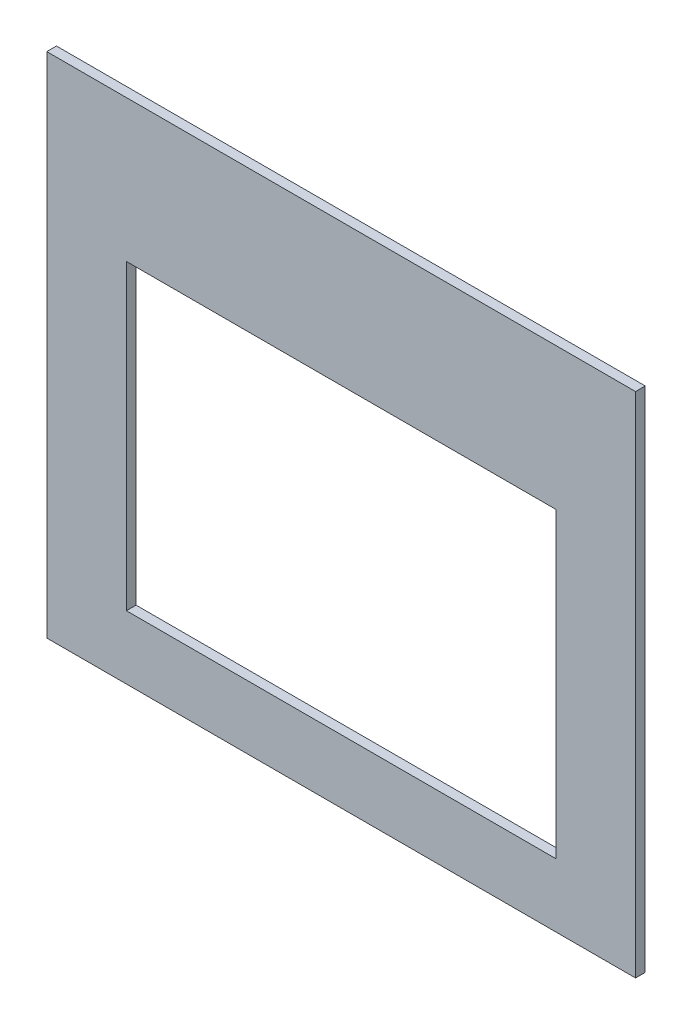
ISO-10303-21;
HEADER;
FILE_DESCRIPTION(('STEP AP214'),'2;1');
FILE_NAME('part.step','',(''),(''),'','','');
FILE_SCHEMA(('AUTOMOTIVE_DESIGN { 1 0 10303 214 1 1 1 1 }'));
ENDSEC;
DATA;
#1=APPLICATION_CONTEXT('core data for automotive mechanical design processes');
#2=APPLICATION_PROTOCOL_DEFINITION('international standard','automotive_design',2000,#1);
#3=PRODUCT_CONTEXT('',#1,'mechanical');
#4=PRODUCT('Part','Part','',(#3));
#5=PRODUCT_RELATED_PRODUCT_CATEGORY('part','',(#4));
#6=PRODUCT_DEFINITION_FORMATION('','',#4);
#7=PRODUCT_DEFINITION_CONTEXT('part definition',#1,'design');
#8=PRODUCT_DEFINITION('design','',#6,#7);
#9=PRODUCT_DEFINITION_SHAPE('','',#8);
#10=(LENGTH_UNIT() NAMED_UNIT(*) SI_UNIT(.MILLI.,.METRE.));
#11=(NAMED_UNIT(*) PLANE_ANGLE_UNIT() SI_UNIT($,.RADIAN.));
#12=(NAMED_UNIT(*) SI_UNIT($,.STERADIAN.) SOLID_ANGLE_UNIT());
#13=UNCERTAINTY_MEASURE_WITH_UNIT(LENGTH_MEASURE(1.E-05),#10,'distance_accuracy_value','');
#14=(GEOMETRIC_REPRESENTATION_CONTEXT(3) GLOBAL_UNCERTAINTY_ASSIGNED_CONTEXT((#13)) GLOBAL_UNIT_ASSIGNED_CONTEXT((#10,
#11,#12)) REPRESENTATION_CONTEXT('',''));
#15=CARTESIAN_POINT('',(0.,0.,0.));
#16=DIRECTION('',(0.,0.,1.));
#17=DIRECTION('',(1.,0.,0.));
#18=AXIS2_PLACEMENT_3D('',#15,#16,#17);
#19=CARTESIAN_POINT('',(-133.,925.901471862582,18.));
#20=DIRECTION('',(1.,0.,0.));
#21=DIRECTION('',(0.,0.,-1.));
#22=AXIS2_PLACEMENT_3D('',#19,#20,#21);
#23=PLANE('',#22);
#24=DIRECTION('',(0.,-1.,0.));
#25=VECTOR('',#24,1.);
#26=CARTESIAN_POINT('',(-133.,925.901471862582,0.));
#27=LINE('',#26,#25);
#28=CARTESIAN_POINT('',(-133.,925.901471862582,0.));
#29=VERTEX_POINT('',#28);
#30=CARTESIAN_POINT('',(-133.,-17.9999999999999,0.));
#31=VERTEX_POINT('',#30);
#32=EDGE_CURVE('E130',#29,#31,#27,.T.);
#33=ORIENTED_EDGE('',*,*,#32,.T.);
#34=DIRECTION('',(0.,0.,-1.));
#35=VECTOR('',#34,1.);
#36=CARTESIAN_POINT('',(-133.,-17.9999999999999,18.));
#37=LINE('',#36,#35);
#38=CARTESIAN_POINT('',(-133.,-17.9999999999999,18.));
#39=VERTEX_POINT('',#38);
#40=EDGE_CURVE('E11',#39,#31,#37,.T.);
#41=ORIENTED_EDGE('',*,*,#40,.F.);
#42=DIRECTION('',(0.,-1.,0.));
#43=VECTOR('',#42,1.);
#44=CARTESIAN_POINT('',(-133.,925.901471862582,18.));
#45=LINE('',#44,#43);
#46=CARTESIAN_POINT('',(-133.,925.901471862582,18.));
#47=VERTEX_POINT('',#46);
#48=EDGE_CURVE('E134',#47,#39,#45,.T.);
#49=ORIENTED_EDGE('',*,*,#48,.F.);
#50=DIRECTION('',(0.,0.,-1.));
#51=VECTOR('',#50,1.);
#52=CARTESIAN_POINT('',(-133.,925.901471862582,18.));
#53=LINE('',#52,#51);
#54=EDGE_CURVE('E144',#47,#29,#53,.T.);
#55=ORIENTED_EDGE('',*,*,#54,.T.);
#56=EDGE_LOOP('',(#33,#41,#49,#55));
#57=FACE_BOUND('',#56,.T.);
#58=ADVANCED_FACE('F34',(#57),#23,.F.);
#59=CARTESIAN_POINT('',(-133.,-17.9999999999999,18.));
#60=DIRECTION('',(0.,1.,0.));
#61=DIRECTION('',(0.,0.,1.));
#62=AXIS2_PLACEMENT_3D('',#59,#60,#61);
#63=PLANE('',#62);
#64=DIRECTION('',(1.,0.,0.));
#65=VECTOR('',#64,1.);
#66=CARTESIAN_POINT('',(-133.,-17.9999999999999,0.));
#67=LINE('',#66,#65);
#68=CARTESIAN_POINT('',(961.236516537715,-17.9999999999999,0.));
#69=VERTEX_POINT('',#68);
#70=EDGE_CURVE('E147',#31,#69,#67,.T.);
#71=ORIENTED_EDGE('',*,*,#70,.T.);
#72=DIRECTION('',(0.,0.,-1.));
#73=VECTOR('',#72,1.);
#74=CARTESIAN_POINT('',(961.236516537715,-17.9999999999999,18.));
#75=LINE('',#74,#73);
#76=CARTESIAN_POINT('',(961.236516537715,-17.9999999999999,18.));
#77=VERTEX_POINT('',#76);
#78=EDGE_CURVE('E41',#77,#69,#75,.T.);
#79=ORIENTED_EDGE('',*,*,#78,.F.);
#80=DIRECTION('',(1.,0.,0.));
#81=VECTOR('',#80,1.);
#82=CARTESIAN_POINT('',(-133.,-17.9999999999999,18.));
#83=LINE('',#82,#81);
#84=EDGE_CURVE('E137',#39,#77,#83,.T.);
#85=ORIENTED_EDGE('',*,*,#84,.F.);
#86=ORIENTED_EDGE('',*,*,#40,.T.);
#87=EDGE_LOOP('',(#71,#79,#85,#86));
#88=FACE_BOUND('',#87,.T.);
#89=ADVANCED_FACE('F175',(#88),#63,.F.);
#90=CARTESIAN_POINT('',(961.236516537715,925.901471862582,18.));
#91=DIRECTION('',(-1.,0.,0.));
#92=DIRECTION('',(0.,0.,1.));
#93=AXIS2_PLACEMENT_3D('',#90,#91,#92);
#94=PLANE('',#93);
#95=DIRECTION('',(0.,1.,0.));
#96=VECTOR('',#95,1.);
#97=CARTESIAN_POINT('',(961.236516537715,925.901471862582,0.));
#98=LINE('',#97,#96);
#99=CARTESIAN_POINT('',(961.236516537715,925.901471862582,0.));
#100=VERTEX_POINT('',#99);
#101=EDGE_CURVE('E149',#69,#100,#98,.T.);
#102=ORIENTED_EDGE('',*,*,#101,.T.);
#103=DIRECTION('',(0.,0.,-1.));
#104=VECTOR('',#103,1.);
#105=CARTESIAN_POINT('',(961.236516537715,925.901471862582,18.));
#106=LINE('',#105,#104);
#107=CARTESIAN_POINT('',(961.236516537715,925.901471862582,18.));
#108=VERTEX_POINT('',#107);
#109=EDGE_CURVE('E154',#108,#100,#106,.T.);
#110=ORIENTED_EDGE('',*,*,#109,.F.);
#111=DIRECTION('',(0.,1.,0.));
#112=VECTOR('',#111,1.);
#113=CARTESIAN_POINT('',(961.236516537715,925.901471862582,18.));
#114=LINE('',#113,#112);
#115=EDGE_CURVE('E140',#77,#108,#114,.T.);
#116=ORIENTED_EDGE('',*,*,#115,.F.);
#117=ORIENTED_EDGE('',*,*,#78,.T.);
#118=EDGE_LOOP('',(#102,#110,#116,#117));
#119=FACE_BOUND('',#118,.T.);
#120=ADVANCED_FACE('F161',(#119),#94,.F.);
#121=CARTESIAN_POINT('',(-133.,925.901471862582,18.));
#122=DIRECTION('',(0.,-1.,0.));
#123=DIRECTION('',(0.,0.,-1.));
#124=AXIS2_PLACEMENT_3D('',#121,#122,#123);
#125=PLANE('',#124);
#126=DIRECTION('',(-1.,0.,0.));
#127=VECTOR('',#126,1.);
#128=CARTESIAN_POINT('',(-133.,925.901471862582,0.));
#129=LINE('',#128,#127);
#130=EDGE_CURVE('E138',#100,#29,#129,.T.);
#131=ORIENTED_EDGE('',*,*,#130,.T.);
#132=ORIENTED_EDGE('',*,*,#54,.F.);
#133=DIRECTION('',(-1.,0.,0.));
#134=VECTOR('',#133,1.);
#135=CARTESIAN_POINT('',(-133.,925.901471862582,18.));
#136=LINE('',#135,#134);
#137=EDGE_CURVE('E142',#108,#47,#136,.T.);
#138=ORIENTED_EDGE('',*,*,#137,.F.);
#139=ORIENTED_EDGE('',*,*,#109,.T.);
#140=EDGE_LOOP('',(#131,#132,#138,#139));
#141=FACE_BOUND('',#140,.T.);
#142=ADVANCED_FACE('F168',(#141),#125,.F.);
#143=CARTESIAN_POINT('',(0.,0.,18.));
#144=DIRECTION('',(0.,0.,1.));
#145=DIRECTION('',(1.,0.,0.));
#146=AXIS2_PLACEMENT_3D('',#143,#144,#145);
#147=PLANE('',#146);
#148=DIRECTION('',(-1.,0.,0.));
#149=VECTOR('',#148,1.);
#150=CARTESIAN_POINT('',(813.236516537715,662.151471862577,18.));
#151=LINE('',#150,#149);
#152=CARTESIAN_POINT('',(813.236516537715,662.151471862577,18.));
#153=VERTEX_POINT('',#152);
#154=CARTESIAN_POINT('',(14.9999999999998,662.151471862577,18.));
#155=VERTEX_POINT('',#154);
#156=EDGE_CURVE('E48',#153,#155,#151,.T.);
#157=ORIENTED_EDGE('',*,*,#156,.F.);
#158=DIRECTION('',(0.,1.,0.));
#159=VECTOR('',#158,1.);
#160=CARTESIAN_POINT('',(813.236516537715,100.000000000005,18.));
#161=LINE('',#160,#159);
#162=CARTESIAN_POINT('',(813.236516537715,100.000000000005,18.));
#163=VERTEX_POINT('',#162);
#164=EDGE_CURVE('E115',#163,#153,#161,.T.);
#165=ORIENTED_EDGE('',*,*,#164,.F.);
#166=DIRECTION('',(-1.,0.,0.));
#167=VECTOR('',#166,1.);
#168=CARTESIAN_POINT('',(813.236516537715,100.000000000005,18.));
#169=LINE('',#168,#167);
#170=CARTESIAN_POINT('',(14.9999999999998,100.000000000005,18.));
#171=VERTEX_POINT('',#170);
#172=EDGE_CURVE('E118',#163,#171,#169,.T.);
#173=ORIENTED_EDGE('',*,*,#172,.T.);
#174=DIRECTION('',(0.,1.,0.));
#175=VECTOR('',#174,1.);
#176=CARTESIAN_POINT('',(14.9999999999998,100.000000000005,18.));
#177=LINE('',#176,#175);
#178=EDGE_CURVE('E124',#171,#155,#177,.T.);
#179=ORIENTED_EDGE('',*,*,#178,.T.);
#180=EDGE_LOOP('',(#157,#165,#173,#179));
#181=FACE_BOUND('',#180,.T.);
#182=ORIENTED_EDGE('',*,*,#48,.T.);
#183=ORIENTED_EDGE('',*,*,#84,.T.);
#184=ORIENTED_EDGE('',*,*,#115,.T.);
#185=ORIENTED_EDGE('',*,*,#137,.T.);
#186=EDGE_LOOP('',(#182,#183,#184,#185));
#187=FACE_BOUND('',#186,.T.);
#188=ADVANCED_FACE('F174',(#181,#187),#147,.T.);
#189=CARTESIAN_POINT('',(0.,0.,0.));
#190=DIRECTION('',(0.,0.,1.));
#191=DIRECTION('',(1.,0.,0.));
#192=AXIS2_PLACEMENT_3D('',#189,#190,#191);
#193=PLANE('',#192);
#194=DIRECTION('',(0.,1.,0.));
#195=VECTOR('',#194,1.);
#196=CARTESIAN_POINT('',(813.236516537715,100.000000000005,0.));
#197=LINE('',#196,#195);
#198=CARTESIAN_POINT('',(813.236516537715,100.000000000005,0.));
#199=VERTEX_POINT('',#198);
#200=CARTESIAN_POINT('',(813.236516537715,662.151471862577,0.));
#201=VERTEX_POINT('',#200);
#202=EDGE_CURVE('E110',#199,#201,#197,.T.);
#203=ORIENTED_EDGE('',*,*,#202,.T.);
#204=DIRECTION('',(-1.,0.,0.));
#205=VECTOR('',#204,1.);
#206=CARTESIAN_POINT('',(813.236516537715,662.151471862577,0.));
#207=LINE('',#206,#205);
#208=CARTESIAN_POINT('',(14.9999999999998,662.151471862577,0.));
#209=VERTEX_POINT('',#208);
#210=EDGE_CURVE('E105',#201,#209,#207,.T.);
#211=ORIENTED_EDGE('',*,*,#210,.T.);
#212=DIRECTION('',(0.,1.,0.));
#213=VECTOR('',#212,1.);
#214=CARTESIAN_POINT('',(14.9999999999998,100.000000000005,0.));
#215=LINE('',#214,#213);
#216=CARTESIAN_POINT('',(14.9999999999998,100.000000000005,0.));
#217=VERTEX_POINT('',#216);
#218=EDGE_CURVE('E97',#217,#209,#215,.T.);
#219=ORIENTED_EDGE('',*,*,#218,.F.);
#220=DIRECTION('',(-1.,0.,0.));
#221=VECTOR('',#220,1.);
#222=CARTESIAN_POINT('',(813.236516537715,100.000000000005,0.));
#223=LINE('',#222,#221);
#224=EDGE_CURVE('E104',#199,#217,#223,.T.);
#225=ORIENTED_EDGE('',*,*,#224,.F.);
#226=EDGE_LOOP('',(#203,#211,#219,#225));
#227=FACE_BOUND('',#226,.T.);
#228=ORIENTED_EDGE('',*,*,#32,.F.);
#229=ORIENTED_EDGE('',*,*,#130,.F.);
#230=ORIENTED_EDGE('',*,*,#101,.F.);
#231=ORIENTED_EDGE('',*,*,#70,.F.);
#232=EDGE_LOOP('',(#228,#229,#230,#231));
#233=FACE_BOUND('',#232,.T.);
#234=ADVANCED_FACE('F112',(#227,#233),#193,.F.);
#235=CARTESIAN_POINT('',(813.236516537715,662.151471862577,0.));
#236=DIRECTION('',(0.,1.,0.));
#237=DIRECTION('',(-1.,0.,0.));
#238=AXIS2_PLACEMENT_3D('',#235,#236,#237);
#239=PLANE('',#238);
#240=ORIENTED_EDGE('',*,*,#156,.T.);
#241=DIRECTION('',(0.,0.,1.));
#242=VECTOR('',#241,1.);
#243=CARTESIAN_POINT('',(14.9999999999998,662.151471862577,0.));
#244=LINE('',#243,#242);
#245=EDGE_CURVE('E99',#209,#155,#244,.T.);
#246=ORIENTED_EDGE('',*,*,#245,.F.);
#247=ORIENTED_EDGE('',*,*,#210,.F.);
#248=DIRECTION('',(0.,0.,1.));
#249=VECTOR('',#248,1.);
#250=CARTESIAN_POINT('',(813.236516537715,662.151471862577,0.));
#251=LINE('',#250,#249);
#252=EDGE_CURVE('E128',#201,#153,#251,.T.);
#253=ORIENTED_EDGE('',*,*,#252,.T.);
#254=EDGE_LOOP('',(#240,#246,#247,#253));
#255=FACE_BOUND('',#254,.T.);
#256=ADVANCED_FACE('F108',(#255),#239,.F.);
#257=CARTESIAN_POINT('',(813.236516537715,100.000000000005,0.));
#258=DIRECTION('',(1.,0.,0.));
#259=DIRECTION('',(0.,0.,-1.));
#260=AXIS2_PLACEMENT_3D('',#257,#258,#259);
#261=PLANE('',#260);
#262=ORIENTED_EDGE('',*,*,#164,.T.);
#263=ORIENTED_EDGE('',*,*,#252,.F.);
#264=ORIENTED_EDGE('',*,*,#202,.F.);
#265=DIRECTION('',(0.,0.,1.));
#266=VECTOR('',#265,1.);
#267=CARTESIAN_POINT('',(813.236516537715,100.000000000005,0.));
#268=LINE('',#267,#266);
#269=EDGE_CURVE('E131',#199,#163,#268,.T.);
#270=ORIENTED_EDGE('',*,*,#269,.T.);
#271=EDGE_LOOP('',(#262,#263,#264,#270));
#272=FACE_BOUND('',#271,.T.);
#273=ADVANCED_FACE('F192',(#272),#261,.F.);
#274=CARTESIAN_POINT('',(813.236516537715,100.000000000005,0.));
#275=DIRECTION('',(0.,1.,0.));
#276=DIRECTION('',(0.,0.,1.));
#277=AXIS2_PLACEMENT_3D('',#274,#275,#276);
#278=PLANE('',#277);
#279=ORIENTED_EDGE('',*,*,#172,.F.);
#280=ORIENTED_EDGE('',*,*,#269,.F.);
#281=ORIENTED_EDGE('',*,*,#224,.T.);
#282=DIRECTION('',(0.,0.,1.));
#283=VECTOR('',#282,1.);
#284=CARTESIAN_POINT('',(14.9999999999998,100.000000000005,0.));
#285=LINE('',#284,#283);
#286=EDGE_CURVE('E56',#217,#171,#285,.T.);
#287=ORIENTED_EDGE('',*,*,#286,.T.);
#288=EDGE_LOOP('',(#279,#280,#281,#287));
#289=FACE_BOUND('',#288,.T.);
#290=ADVANCED_FACE('F195',(#289),#278,.T.);
#291=CARTESIAN_POINT('',(14.9999999999998,100.000000000005,0.));
#292=DIRECTION('',(1.,0.,0.));
#293=DIRECTION('',(0.,0.,-1.));
#294=AXIS2_PLACEMENT_3D('',#291,#292,#293);
#295=PLANE('',#294);
#296=ORIENTED_EDGE('',*,*,#178,.F.);
#297=ORIENTED_EDGE('',*,*,#286,.F.);
#298=ORIENTED_EDGE('',*,*,#218,.T.);
#299=ORIENTED_EDGE('',*,*,#245,.T.);
#300=EDGE_LOOP('',(#296,#297,#298,#299));
#301=FACE_BOUND('',#300,.T.);
#302=ADVANCED_FACE('F98',(#301),#295,.T.);
#303=CLOSED_SHELL('',(#58,#89,#120,#142,#188,#234,#256,#273,#290,#302));
#304=MANIFOLD_SOLID_BREP('B2',#303);
#305=ADVANCED_BREP_SHAPE_REPRESENTATION('',(#18,#304),#14);
#306=SHAPE_DEFINITION_REPRESENTATION(#9,#305);
ENDSEC;
END-ISO-10303-21;
